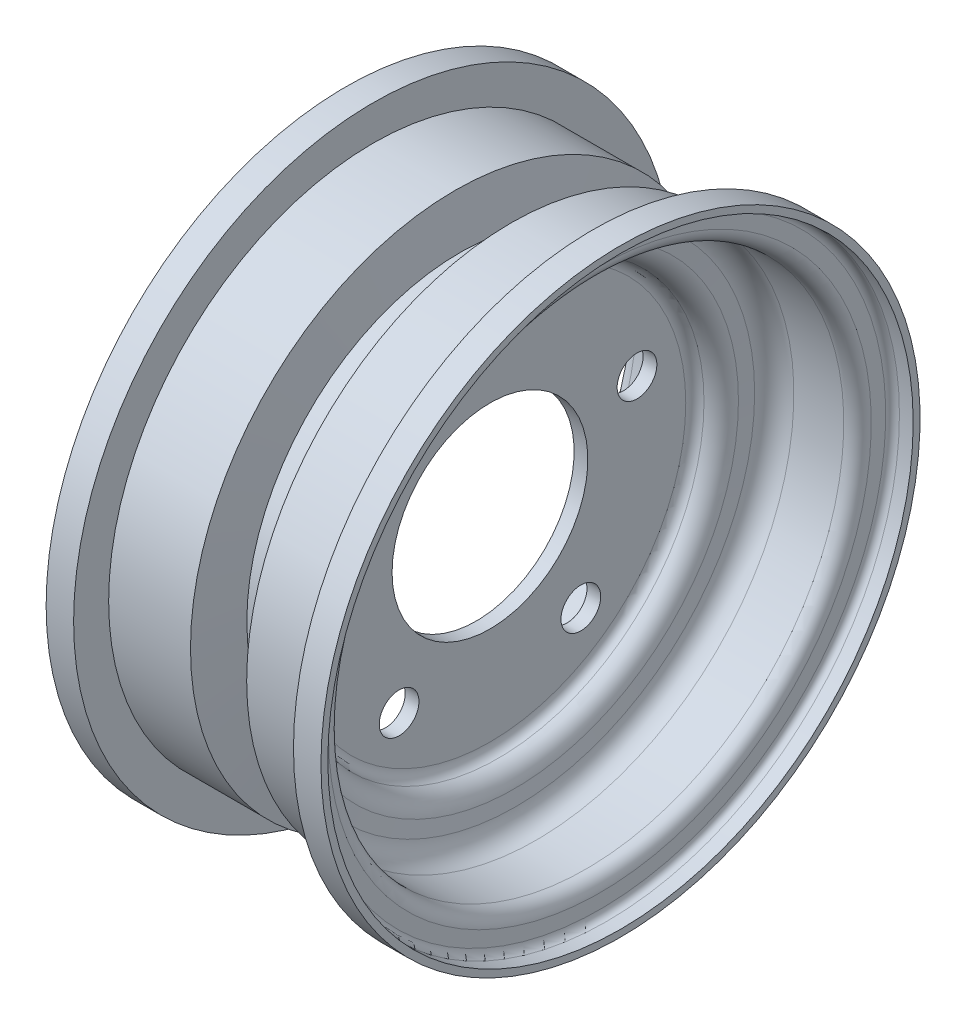
ISO-10303-21;
HEADER;
FILE_DESCRIPTION(('STEP AP214'),'2;1');
FILE_NAME('part.step','',(''),(''),'','','');
FILE_SCHEMA(('AUTOMOTIVE_DESIGN { 1 0 10303 214 1 1 1 1 }'));
ENDSEC;
DATA;
#1=APPLICATION_CONTEXT('core data for automotive mechanical design processes');
#2=APPLICATION_PROTOCOL_DEFINITION('international standard','automotive_design',2000,#1);
#3=PRODUCT_CONTEXT('',#1,'mechanical');
#4=PRODUCT('Part','Part','',(#3));
#5=PRODUCT_RELATED_PRODUCT_CATEGORY('part','',(#4));
#6=PRODUCT_DEFINITION_FORMATION('','',#4);
#7=PRODUCT_DEFINITION_CONTEXT('part definition',#1,'design');
#8=PRODUCT_DEFINITION('design','',#6,#7);
#9=PRODUCT_DEFINITION_SHAPE('','',#8);
#10=(LENGTH_UNIT() NAMED_UNIT(*) SI_UNIT(.MILLI.,.METRE.));
#11=(NAMED_UNIT(*) PLANE_ANGLE_UNIT() SI_UNIT($,.RADIAN.));
#12=(NAMED_UNIT(*) SI_UNIT($,.STERADIAN.) SOLID_ANGLE_UNIT());
#13=UNCERTAINTY_MEASURE_WITH_UNIT(LENGTH_MEASURE(1.E-05),#10,'distance_accuracy_value','');
#14=(GEOMETRIC_REPRESENTATION_CONTEXT(3) GLOBAL_UNCERTAINTY_ASSIGNED_CONTEXT((#13)) GLOBAL_UNIT_ASSIGNED_CONTEXT((#10,
#11,#12)) REPRESENTATION_CONTEXT('',''));
#15=CARTESIAN_POINT('',(0.,0.,0.));
#16=DIRECTION('',(0.,0.,1.));
#17=DIRECTION('',(1.,0.,0.));
#18=AXIS2_PLACEMENT_3D('',#15,#16,#17);
#19=CARTESIAN_POINT('',(0.,0.,0.));
#20=DIRECTION('',(-1.,0.,0.));
#21=DIRECTION('',(0.,0.,1.));
#22=AXIS2_PLACEMENT_3D('',#19,#20,#21);
#23=CYLINDRICAL_SURFACE('',#22,110.744);
#24=CARTESIAN_POINT('',(50.8,0.,0.));
#25=DIRECTION('',(-1.,0.,0.));
#26=DIRECTION('',(0.,0.,1.));
#27=AXIS2_PLACEMENT_3D('',#24,#25,#26);
#28=CIRCLE('',#27,110.744);
#29=CARTESIAN_POINT('',(50.8,0.,110.744));
#30=VERTEX_POINT('',#29);
#31=EDGE_CURVE('E130',#30,#30,#28,.T.);
#32=ORIENTED_EDGE('',*,*,#31,.T.);
#33=EDGE_LOOP('',(#32));
#34=FACE_BOUND('',#33,.T.);
#35=CARTESIAN_POINT('',(40.64,0.,0.));
#36=DIRECTION('',(-1.,0.,0.));
#37=DIRECTION('',(0.,0.,1.));
#38=AXIS2_PLACEMENT_3D('',#35,#36,#37);
#39=CIRCLE('',#38,110.744);
#40=CARTESIAN_POINT('',(40.64,0.,110.744));
#41=VERTEX_POINT('',#40);
#42=EDGE_CURVE('E99',#41,#41,#39,.T.);
#43=ORIENTED_EDGE('',*,*,#42,.F.);
#44=EDGE_LOOP('',(#43));
#45=FACE_BOUND('',#44,.T.);
#46=ADVANCED_FACE('F37',(#34,#45),#23,.T.);
#47=CARTESIAN_POINT('',(40.64,0.,0.));
#48=DIRECTION('',(-1.,0.,0.));
#49=DIRECTION('',(0.,0.,1.));
#50=AXIS2_PLACEMENT_3D('',#47,#48,#49);
#51=PLANE('',#50);
#52=ORIENTED_EDGE('',*,*,#42,.T.);
#53=EDGE_LOOP('',(#52));
#54=FACE_BOUND('',#53,.T.);
#55=CARTESIAN_POINT('',(40.64,0.,0.));
#56=DIRECTION('',(-1.,0.,0.));
#57=DIRECTION('',(0.,0.,1.));
#58=AXIS2_PLACEMENT_3D('',#55,#56,#57);
#59=CIRCLE('',#58,97.79);
#60=CARTESIAN_POINT('',(40.64,0.,97.79));
#61=VERTEX_POINT('',#60);
#62=EDGE_CURVE('E115',#61,#61,#59,.T.);
#63=ORIENTED_EDGE('',*,*,#62,.F.);
#64=EDGE_LOOP('',(#63));
#65=FACE_BOUND('',#64,.T.);
#66=ADVANCED_FACE('F216',(#54,#65),#51,.T.);
#67=CARTESIAN_POINT('',(0.,0.,0.));
#68=DIRECTION('',(-1.,0.,0.));
#69=DIRECTION('',(0.,0.,1.));
#70=AXIS2_PLACEMENT_3D('',#67,#68,#69);
#71=CYLINDRICAL_SURFACE('',#70,97.79);
#72=ORIENTED_EDGE('',*,*,#62,.T.);
#73=EDGE_LOOP('',(#72));
#74=FACE_BOUND('',#73,.T.);
#75=CARTESIAN_POINT('',(10.3860275441826,0.,0.));
#76=DIRECTION('',(-1.,0.,0.));
#77=DIRECTION('',(0.,0.,1.));
#78=AXIS2_PLACEMENT_3D('',#75,#76,#77);
#79=CIRCLE('',#78,97.79);
#80=CARTESIAN_POINT('',(10.3860275441826,0.,97.79));
#81=VERTEX_POINT('',#80);
#82=EDGE_CURVE('E118',#81,#81,#79,.T.);
#83=ORIENTED_EDGE('',*,*,#82,.F.);
#84=EDGE_LOOP('',(#83));
#85=FACE_BOUND('',#84,.T.);
#86=ADVANCED_FACE('F222',(#74,#85),#71,.T.);
#87=CARTESIAN_POINT('',(8.60802754418257,0.,0.));
#88=DIRECTION('',(1.,0.,0.));
#89=DIRECTION('',(0.,0.,-1.));
#90=AXIS2_PLACEMENT_3D('',#87,#88,#89);
#91=CONICAL_SURFACE('',#90,78.74,1.47773259807048);
#92=ORIENTED_EDGE('',*,*,#82,.T.);
#93=EDGE_LOOP('',(#92));
#94=FACE_BOUND('',#93,.T.);
#95=CARTESIAN_POINT('',(8.60802754418257,0.,0.));
#96=DIRECTION('',(-1.,0.,0.));
#97=DIRECTION('',(0.,0.,1.));
#98=AXIS2_PLACEMENT_3D('',#95,#96,#97);
#99=CIRCLE('',#98,78.74);
#100=CARTESIAN_POINT('',(8.60802754418257,0.,78.74));
#101=VERTEX_POINT('',#100);
#102=EDGE_CURVE('E121',#101,#101,#99,.T.);
#103=ORIENTED_EDGE('',*,*,#102,.F.);
#104=EDGE_LOOP('',(#103));
#105=FACE_BOUND('',#104,.T.);
#106=ADVANCED_FACE('F571',(#94,#105),#91,.T.);
#107=CARTESIAN_POINT('',(0.,0.,0.));
#108=DIRECTION('',(-1.,0.,0.));
#109=DIRECTION('',(0.,0.,1.));
#110=AXIS2_PLACEMENT_3D('',#107,#108,#109);
#111=CYLINDRICAL_SURFACE('',#110,78.74);
#112=ORIENTED_EDGE('',*,*,#102,.T.);
#113=EDGE_LOOP('',(#112));
#114=FACE_BOUND('',#113,.T.);
#115=CARTESIAN_POINT('',(-8.60802754418257,0.,0.));
#116=DIRECTION('',(-1.,0.,0.));
#117=DIRECTION('',(0.,0.,1.));
#118=AXIS2_PLACEMENT_3D('',#115,#116,#117);
#119=CIRCLE('',#118,78.74);
#120=CARTESIAN_POINT('',(-8.60802754418257,0.,78.74));
#121=VERTEX_POINT('',#120);
#122=EDGE_CURVE('E142',#121,#121,#119,.T.);
#123=ORIENTED_EDGE('',*,*,#122,.F.);
#124=EDGE_LOOP('',(#123));
#125=FACE_BOUND('',#124,.T.);
#126=ADVANCED_FACE('F194',(#114,#125),#111,.T.);
#127=CARTESIAN_POINT('',(0.,0.,0.));
#128=DIRECTION('',(-1.,0.,0.));
#129=DIRECTION('',(0.,0.,1.));
#130=AXIS2_PLACEMENT_3D('',#127,#128,#129);
#131=CYLINDRICAL_SURFACE('',#130,36.195);
#132=CARTESIAN_POINT('',(2.54,0.,0.));
#133=DIRECTION('',(-1.,0.,0.));
#134=DIRECTION('',(0.,0.,1.));
#135=AXIS2_PLACEMENT_3D('',#132,#133,#134);
#136=CIRCLE('',#135,36.195);
#137=CARTESIAN_POINT('',(2.54,0.,36.195));
#138=VERTEX_POINT('',#137);
#139=EDGE_CURVE('E124',#138,#138,#136,.T.);
#140=ORIENTED_EDGE('',*,*,#139,.F.);
#141=EDGE_LOOP('',(#140));
#142=FACE_BOUND('',#141,.T.);
#143=CARTESIAN_POINT('',(-2.54,0.,0.));
#144=DIRECTION('',(-1.,0.,0.));
#145=DIRECTION('',(0.,0.,1.));
#146=AXIS2_PLACEMENT_3D('',#143,#144,#145);
#147=CIRCLE('',#146,36.195);
#148=CARTESIAN_POINT('',(-2.54,0.,36.195));
#149=VERTEX_POINT('',#148);
#150=EDGE_CURVE('E145',#149,#149,#147,.T.);
#151=ORIENTED_EDGE('',*,*,#150,.T.);
#152=EDGE_LOOP('',(#151));
#153=FACE_BOUND('',#152,.T.);
#154=ADVANCED_FACE('F179',(#142,#153),#131,.F.);
#155=CARTESIAN_POINT('',(2.54,0.,0.));
#156=DIRECTION('',(-1.,0.,0.));
#157=DIRECTION('',(0.,0.,1.));
#158=AXIS2_PLACEMENT_3D('',#155,#156,#157);
#159=PLANE('',#158);
#160=CARTESIAN_POINT('',(2.54,0.,0.));
#161=DIRECTION('',(-1.,0.,0.));
#162=DIRECTION('',(0.,0.,1.));
#163=AXIS2_PLACEMENT_3D('',#160,#161,#162);
#164=CIRCLE('',#163,72.39);
#165=CARTESIAN_POINT('',(2.54,0.,72.39));
#166=VERTEX_POINT('',#165);
#167=EDGE_CURVE('E93',#166,#166,#164,.F.);
#168=ORIENTED_EDGE('',*,*,#167,.T.);
#169=EDGE_LOOP('',(#168));
#170=FACE_BOUND('',#169,.T.);
#171=CARTESIAN_POINT('',(2.54,57.15,0.));
#172=DIRECTION('',(1.,0.,0.));
#173=DIRECTION('',(0.,0.,-1.));
#174=AXIS2_PLACEMENT_3D('',#171,#172,#173);
#175=CIRCLE('',#174,7.342251);
#176=CARTESIAN_POINT('',(2.54,57.15,-7.34225099999993));
#177=VERTEX_POINT('',#176);
#178=EDGE_CURVE('E168',#177,#177,#175,.T.);
#179=ORIENTED_EDGE('',*,*,#178,.F.);
#180=EDGE_LOOP('',(#179));
#181=FACE_BOUND('',#180,.T.);
#182=CARTESIAN_POINT('',(2.54,17.6603212285283,-54.3528799062679));
#183=DIRECTION('',(1.,0.,0.));
#184=DIRECTION('',(0.,0.,-1.));
#185=AXIS2_PLACEMENT_3D('',#182,#183,#184);
#186=CIRCLE('',#185,7.34225099999999);
#187=CARTESIAN_POINT('',(2.54,17.6603212285283,-61.6951309062679));
#188=VERTEX_POINT('',#187);
#189=EDGE_CURVE('E104',#188,#188,#186,.T.);
#190=ORIENTED_EDGE('',*,*,#189,.F.);
#191=EDGE_LOOP('',(#190));
#192=FACE_BOUND('',#191,.T.);
#193=CARTESIAN_POINT('',(2.54,-46.2353212285282,-33.5919271685147));
#194=DIRECTION('',(1.,0.,0.));
#195=DIRECTION('',(0.,0.,-1.));
#196=AXIS2_PLACEMENT_3D('',#193,#194,#195);
#197=CIRCLE('',#196,7.34225099999999);
#198=CARTESIAN_POINT('',(2.54,-46.2353212285282,-40.9341781685147));
#199=VERTEX_POINT('',#198);
#200=EDGE_CURVE('E103',#199,#199,#197,.T.);
#201=ORIENTED_EDGE('',*,*,#200,.F.);
#202=EDGE_LOOP('',(#201));
#203=FACE_BOUND('',#202,.T.);
#204=CARTESIAN_POINT('',(2.54,-46.2353212285282,33.5919271685149));
#205=DIRECTION('',(1.,0.,0.));
#206=DIRECTION('',(0.,0.,-1.));
#207=AXIS2_PLACEMENT_3D('',#204,#205,#206);
#208=CIRCLE('',#207,7.34225099999999);
#209=CARTESIAN_POINT('',(2.54,-46.2353212285282,26.2496761685149));
#210=VERTEX_POINT('',#209);
#211=EDGE_CURVE('E108',#210,#210,#208,.T.);
#212=ORIENTED_EDGE('',*,*,#211,.F.);
#213=EDGE_LOOP('',(#212));
#214=FACE_BOUND('',#213,.T.);
#215=CARTESIAN_POINT('',(2.54,17.6603212285283,54.352879906268));
#216=DIRECTION('',(1.,0.,0.));
#217=DIRECTION('',(0.,0.,-1.));
#218=AXIS2_PLACEMENT_3D('',#215,#216,#217);
#219=CIRCLE('',#218,7.34225099999999);
#220=CARTESIAN_POINT('',(2.54,17.6603212285283,47.010628906268));
#221=VERTEX_POINT('',#220);
#222=EDGE_CURVE('E112',#221,#221,#219,.T.);
#223=ORIENTED_EDGE('',*,*,#222,.F.);
#224=EDGE_LOOP('',(#223));
#225=FACE_BOUND('',#224,.T.);
#226=ORIENTED_EDGE('',*,*,#139,.T.);
#227=EDGE_LOOP('',(#226));
#228=FACE_BOUND('',#227,.T.);
#229=ADVANCED_FACE('F175',(#170,#181,#192,#203,#214,#225,#228),#159,.F.);
#230=CARTESIAN_POINT('',(10.922,0.,0.));
#231=DIRECTION('',(1.,0.,0.));
#232=DIRECTION('',(0.,0.,-1.));
#233=AXIS2_PLACEMENT_3D('',#230,#231,#232);
#234=CONICAL_SURFACE('',#233,76.2,1.47773259807048);
#235=CARTESIAN_POINT('',(12.054891425979,0.,0.));
#236=DIRECTION('',(1.,0.,0.));
#237=DIRECTION('',(0.,0.,-1.));
#238=AXIS2_PLACEMENT_3D('',#235,#236,#237);
#239=CIRCLE('',#238,88.3381224212042);
#240=CARTESIAN_POINT('',(12.054891425979,0.,-88.3381224212042));
#241=VERTEX_POINT('',#240);
#242=EDGE_CURVE('E72',#241,#241,#239,.T.);
#243=ORIENTED_EDGE('',*,*,#242,.T.);
#244=EDGE_LOOP('',(#243));
#245=FACE_BOUND('',#244,.T.);
#246=CARTESIAN_POINT('',(11.5434551145851,0.,0.));
#247=DIRECTION('',(-1.,0.,0.));
#248=DIRECTION('',(0.,0.,1.));
#249=AXIS2_PLACEMENT_3D('',#246,#247,#248);
#250=CIRCLE('',#249,82.8584476562691);
#251=CARTESIAN_POINT('',(11.5434551145851,0.,82.8584476562691));
#252=VERTEX_POINT('',#251);
#253=EDGE_CURVE('E75',#252,#252,#250,.T.);
#254=ORIENTED_EDGE('',*,*,#253,.T.);
#255=EDGE_LOOP('',(#254));
#256=FACE_BOUND('',#255,.T.);
#257=ADVANCED_FACE('F178',(#245,#256),#234,.F.);
#258=CARTESIAN_POINT('',(0.,0.,0.));
#259=DIRECTION('',(-1.,0.,0.));
#260=DIRECTION('',(0.,0.,1.));
#261=AXIS2_PLACEMENT_3D('',#258,#259,#260);
#262=CYLINDRICAL_SURFACE('',#261,95.25);
#263=CARTESIAN_POINT('',(38.1,0.,0.));
#264=DIRECTION('',(-1.,0.,0.));
#265=DIRECTION('',(0.,0.,1.));
#266=AXIS2_PLACEMENT_3D('',#263,#264,#265);
#267=CIRCLE('',#266,95.25);
#268=CARTESIAN_POINT('',(38.1,0.,95.25));
#269=VERTEX_POINT('',#268);
#270=EDGE_CURVE('E57',#269,#269,#267,.F.);
#271=ORIENTED_EDGE('',*,*,#270,.T.);
#272=EDGE_LOOP('',(#271));
#273=FACE_BOUND('',#272,.T.);
#274=CARTESIAN_POINT('',(19.6419173674523,0.,0.));
#275=DIRECTION('',(-1.,0.,0.));
#276=DIRECTION('',(0.,0.,1.));
#277=AXIS2_PLACEMENT_3D('',#274,#275,#276);
#278=CIRCLE('',#277,95.25);
#279=CARTESIAN_POINT('',(19.6419173674523,0.,95.25));
#280=VERTEX_POINT('',#279);
#281=EDGE_CURVE('E78',#280,#280,#278,.T.);
#282=ORIENTED_EDGE('',*,*,#281,.T.);
#283=EDGE_LOOP('',(#282));
#284=FACE_BOUND('',#283,.T.);
#285=ADVANCED_FACE('F370',(#273,#284),#262,.F.);
#286=CARTESIAN_POINT('',(43.18,0.,0.));
#287=DIRECTION('',(-1.,0.,0.));
#288=DIRECTION('',(0.,0.,1.));
#289=AXIS2_PLACEMENT_3D('',#286,#287,#288);
#290=PLANE('',#289);
#291=CARTESIAN_POINT('',(43.18,0.,0.));
#292=DIRECTION('',(-1.,0.,0.));
#293=DIRECTION('',(0.,0.,1.));
#294=AXIS2_PLACEMENT_3D('',#291,#292,#293);
#295=CIRCLE('',#294,105.664);
#296=CARTESIAN_POINT('',(43.18,0.,105.664));
#297=VERTEX_POINT('',#296);
#298=EDGE_CURVE('E10',#297,#297,#295,.F.);
#299=ORIENTED_EDGE('',*,*,#298,.T.);
#300=EDGE_LOOP('',(#299));
#301=FACE_BOUND('',#300,.T.);
#302=CARTESIAN_POINT('',(43.18,0.,0.));
#303=DIRECTION('',(-1.,0.,0.));
#304=DIRECTION('',(0.,0.,1.));
#305=AXIS2_PLACEMENT_3D('',#302,#303,#304);
#306=CIRCLE('',#305,100.33);
#307=CARTESIAN_POINT('',(43.18,0.,100.33));
#308=VERTEX_POINT('',#307);
#309=EDGE_CURVE('E60',#308,#308,#306,.T.);
#310=ORIENTED_EDGE('',*,*,#309,.T.);
#311=EDGE_LOOP('',(#310));
#312=FACE_BOUND('',#311,.T.);
#313=ADVANCED_FACE('F364',(#301,#312),#290,.F.);
#314=CARTESIAN_POINT('',(0.,0.,0.));
#315=DIRECTION('',(-1.,0.,0.));
#316=DIRECTION('',(0.,0.,1.));
#317=AXIS2_PLACEMENT_3D('',#314,#315,#316);
#318=CYLINDRICAL_SURFACE('',#317,108.204);
#319=CARTESIAN_POINT('',(45.72,0.,0.));
#320=DIRECTION('',(-1.,0.,0.));
#321=DIRECTION('',(0.,0.,1.));
#322=AXIS2_PLACEMENT_3D('',#319,#320,#321);
#323=CIRCLE('',#322,108.204);
#324=CARTESIAN_POINT('',(45.72,0.,108.204));
#325=VERTEX_POINT('',#324);
#326=EDGE_CURVE('E44',#325,#325,#323,.T.);
#327=ORIENTED_EDGE('',*,*,#326,.T.);
#328=EDGE_LOOP('',(#327));
#329=FACE_BOUND('',#328,.T.);
#330=CARTESIAN_POINT('',(50.8,0.,0.));
#331=DIRECTION('',(-1.,0.,0.));
#332=DIRECTION('',(0.,0.,1.));
#333=AXIS2_PLACEMENT_3D('',#330,#331,#332);
#334=CIRCLE('',#333,108.204);
#335=CARTESIAN_POINT('',(50.8,0.,108.204));
#336=VERTEX_POINT('',#335);
#337=EDGE_CURVE('E127',#336,#336,#334,.T.);
#338=ORIENTED_EDGE('',*,*,#337,.F.);
#339=EDGE_LOOP('',(#338));
#340=FACE_BOUND('',#339,.T.);
#341=ADVANCED_FACE('F369',(#329,#340),#318,.F.);
#342=CARTESIAN_POINT('',(50.8,1.38777878078145E-13,0.));
#343=DIRECTION('',(1.,0.,0.));
#344=DIRECTION('',(0.,0.,-1.));
#345=AXIS2_PLACEMENT_3D('',#342,#343,#344);
#346=PLANE('',#345);
#347=ORIENTED_EDGE('',*,*,#337,.T.);
#348=EDGE_LOOP('',(#347));
#349=FACE_BOUND('',#348,.T.);
#350=ORIENTED_EDGE('',*,*,#31,.F.);
#351=EDGE_LOOP('',(#350));
#352=FACE_BOUND('',#351,.T.);
#353=ADVANCED_FACE('F382',(#349,#352),#346,.T.);
#354=CARTESIAN_POINT('',(0.,0.,0.));
#355=DIRECTION('',(1.,0.,0.));
#356=DIRECTION('',(0.,0.,1.));
#357=AXIS2_PLACEMENT_3D('',#354,#355,#356);
#358=CYLINDRICAL_SURFACE('',#357,110.744);
#359=CARTESIAN_POINT('',(-50.8,0.,0.));
#360=DIRECTION('',(-1.,0.,0.));
#361=DIRECTION('',(0.,0.,1.));
#362=AXIS2_PLACEMENT_3D('',#359,#360,#361);
#363=CIRCLE('',#362,110.744);
#364=CARTESIAN_POINT('',(-50.8,0.,110.744));
#365=VERTEX_POINT('',#364);
#366=EDGE_CURVE('E151',#365,#365,#363,.T.);
#367=ORIENTED_EDGE('',*,*,#366,.F.);
#368=EDGE_LOOP('',(#367));
#369=FACE_BOUND('',#368,.T.);
#370=CARTESIAN_POINT('',(-40.64,0.,0.));
#371=DIRECTION('',(-1.,0.,0.));
#372=DIRECTION('',(0.,0.,1.));
#373=AXIS2_PLACEMENT_3D('',#370,#371,#372);
#374=CIRCLE('',#373,110.744);
#375=CARTESIAN_POINT('',(-40.64,0.,110.744));
#376=VERTEX_POINT('',#375);
#377=EDGE_CURVE('E133',#376,#376,#374,.T.);
#378=ORIENTED_EDGE('',*,*,#377,.T.);
#379=EDGE_LOOP('',(#378));
#380=FACE_BOUND('',#379,.T.);
#381=ADVANCED_FACE('F516',(#369,#380),#358,.T.);
#382=CARTESIAN_POINT('',(-40.64,0.,0.));
#383=DIRECTION('',(1.,0.,0.));
#384=DIRECTION('',(0.,0.,1.));
#385=AXIS2_PLACEMENT_3D('',#382,#383,#384);
#386=PLANE('',#385);
#387=ORIENTED_EDGE('',*,*,#377,.F.);
#388=EDGE_LOOP('',(#387));
#389=FACE_BOUND('',#388,.T.);
#390=CARTESIAN_POINT('',(-40.64,0.,0.));
#391=DIRECTION('',(-1.,0.,0.));
#392=DIRECTION('',(0.,0.,1.));
#393=AXIS2_PLACEMENT_3D('',#390,#391,#392);
#394=CIRCLE('',#393,97.79);
#395=CARTESIAN_POINT('',(-40.64,0.,97.79));
#396=VERTEX_POINT('',#395);
#397=EDGE_CURVE('E136',#396,#396,#394,.T.);
#398=ORIENTED_EDGE('',*,*,#397,.T.);
#399=EDGE_LOOP('',(#398));
#400=FACE_BOUND('',#399,.T.);
#401=ADVANCED_FACE('F506',(#389,#400),#386,.T.);
#402=CARTESIAN_POINT('',(0.,0.,0.));
#403=DIRECTION('',(1.,0.,0.));
#404=DIRECTION('',(0.,0.,1.));
#405=AXIS2_PLACEMENT_3D('',#402,#403,#404);
#406=CYLINDRICAL_SURFACE('',#405,97.79);
#407=ORIENTED_EDGE('',*,*,#397,.F.);
#408=EDGE_LOOP('',(#407));
#409=FACE_BOUND('',#408,.T.);
#410=CARTESIAN_POINT('',(-10.3860275441826,0.,0.));
#411=DIRECTION('',(-1.,0.,0.));
#412=DIRECTION('',(0.,0.,1.));
#413=AXIS2_PLACEMENT_3D('',#410,#411,#412);
#414=CIRCLE('',#413,97.79);
#415=CARTESIAN_POINT('',(-10.3860275441826,0.,97.79));
#416=VERTEX_POINT('',#415);
#417=EDGE_CURVE('E139',#416,#416,#414,.T.);
#418=ORIENTED_EDGE('',*,*,#417,.T.);
#419=EDGE_LOOP('',(#418));
#420=FACE_BOUND('',#419,.T.);
#421=ADVANCED_FACE('F211',(#409,#420),#406,.T.);
#422=CARTESIAN_POINT('',(-8.60802754418257,0.,0.));
#423=DIRECTION('',(-1.,0.,0.));
#424=DIRECTION('',(0.,0.,-1.));
#425=AXIS2_PLACEMENT_3D('',#422,#423,#424);
#426=CONICAL_SURFACE('',#425,78.74,1.47773259807048);
#427=ORIENTED_EDGE('',*,*,#417,.F.);
#428=EDGE_LOOP('',(#427));
#429=FACE_BOUND('',#428,.T.);
#430=ORIENTED_EDGE('',*,*,#122,.T.);
#431=EDGE_LOOP('',(#430));
#432=FACE_BOUND('',#431,.T.);
#433=ADVANCED_FACE('F201',(#429,#432),#426,.T.);
#434=CARTESIAN_POINT('',(-2.54,0.,0.));
#435=DIRECTION('',(1.,0.,0.));
#436=DIRECTION('',(0.,0.,1.));
#437=AXIS2_PLACEMENT_3D('',#434,#435,#436);
#438=PLANE('',#437);
#439=CARTESIAN_POINT('',(-2.54,0.,0.));
#440=DIRECTION('',(1.,0.,0.));
#441=DIRECTION('',(0.,0.,-1.));
#442=AXIS2_PLACEMENT_3D('',#439,#440,#441);
#443=CIRCLE('',#442,72.39);
#444=CARTESIAN_POINT('',(-2.54,0.,-72.39));
#445=VERTEX_POINT('',#444);
#446=EDGE_CURVE('E96',#445,#445,#443,.F.);
#447=ORIENTED_EDGE('',*,*,#446,.T.);
#448=EDGE_LOOP('',(#447));
#449=FACE_BOUND('',#448,.T.);
#450=CARTESIAN_POINT('',(-2.54,57.15,0.));
#451=DIRECTION('',(1.,0.,0.));
#452=DIRECTION('',(0.,0.,-1.));
#453=AXIS2_PLACEMENT_3D('',#450,#451,#452);
#454=CIRCLE('',#453,7.34225099999999);
#455=CARTESIAN_POINT('',(-2.54,57.15,-7.34225099999992));
#456=VERTEX_POINT('',#455);
#457=EDGE_CURVE('E165',#456,#456,#454,.T.);
#458=ORIENTED_EDGE('',*,*,#457,.T.);
#459=EDGE_LOOP('',(#458));
#460=FACE_BOUND('',#459,.T.);
#461=CARTESIAN_POINT('',(-2.54,17.6603212285283,-54.3528799062679));
#462=DIRECTION('',(1.,0.,0.));
#463=DIRECTION('',(0.,0.,-1.));
#464=AXIS2_PLACEMENT_3D('',#461,#462,#463);
#465=CIRCLE('',#464,7.34225099999999);
#466=CARTESIAN_POINT('',(-2.54,17.6603212285283,-61.6951309062679));
#467=VERTEX_POINT('',#466);
#468=EDGE_CURVE('E100',#467,#467,#465,.T.);
#469=ORIENTED_EDGE('',*,*,#468,.T.);
#470=EDGE_LOOP('',(#469));
#471=FACE_BOUND('',#470,.T.);
#472=CARTESIAN_POINT('',(-2.54,-46.2353212285282,-33.5919271685147));
#473=DIRECTION('',(1.,0.,0.));
#474=DIRECTION('',(0.,0.,-1.));
#475=AXIS2_PLACEMENT_3D('',#472,#473,#474);
#476=CIRCLE('',#475,7.34225099999999);
#477=CARTESIAN_POINT('',(-2.54,-46.2353212285282,-40.9341781685147));
#478=VERTEX_POINT('',#477);
#479=EDGE_CURVE('E105',#478,#478,#476,.T.);
#480=ORIENTED_EDGE('',*,*,#479,.T.);
#481=EDGE_LOOP('',(#480));
#482=FACE_BOUND('',#481,.T.);
#483=CARTESIAN_POINT('',(-2.54,-46.2353212285282,33.5919271685149));
#484=DIRECTION('',(1.,0.,0.));
#485=DIRECTION('',(0.,0.,-1.));
#486=AXIS2_PLACEMENT_3D('',#483,#484,#485);
#487=CIRCLE('',#486,7.34225099999999);
#488=CARTESIAN_POINT('',(-2.54,-46.2353212285282,26.2496761685149));
#489=VERTEX_POINT('',#488);
#490=EDGE_CURVE('E109',#489,#489,#487,.T.);
#491=ORIENTED_EDGE('',*,*,#490,.T.);
#492=EDGE_LOOP('',(#491));
#493=FACE_BOUND('',#492,.T.);
#494=CARTESIAN_POINT('',(-2.54,17.6603212285283,54.352879906268));
#495=DIRECTION('',(1.,0.,0.));
#496=DIRECTION('',(0.,0.,-1.));
#497=AXIS2_PLACEMENT_3D('',#494,#495,#496);
#498=CIRCLE('',#497,7.34225099999999);
#499=CARTESIAN_POINT('',(-2.54,17.6603212285283,47.010628906268));
#500=VERTEX_POINT('',#499);
#501=EDGE_CURVE('E154',#500,#500,#498,.T.);
#502=ORIENTED_EDGE('',*,*,#501,.T.);
#503=EDGE_LOOP('',(#502));
#504=FACE_BOUND('',#503,.T.);
#505=ORIENTED_EDGE('',*,*,#150,.F.);
#506=EDGE_LOOP('',(#505));
#507=FACE_BOUND('',#506,.T.);
#508=ADVANCED_FACE('F198',(#449,#460,#471,#482,#493,#504,#507),#438,.F.);
#509=CARTESIAN_POINT('',(-10.922,0.,0.));
#510=DIRECTION('',(-1.,0.,0.));
#511=DIRECTION('',(0.,0.,-1.));
#512=AXIS2_PLACEMENT_3D('',#509,#510,#511);
#513=CONICAL_SURFACE('',#512,76.2,1.47773259807048);
#514=CARTESIAN_POINT('',(-12.054891425979,0.,0.));
#515=DIRECTION('',(-1.,0.,0.));
#516=DIRECTION('',(0.,0.,1.));
#517=AXIS2_PLACEMENT_3D('',#514,#515,#516);
#518=CIRCLE('',#517,88.3381224212042);
#519=CARTESIAN_POINT('',(-12.054891425979,0.,88.3381224212042));
#520=VERTEX_POINT('',#519);
#521=EDGE_CURVE('E87',#520,#520,#518,.T.);
#522=ORIENTED_EDGE('',*,*,#521,.T.);
#523=EDGE_LOOP('',(#522));
#524=FACE_BOUND('',#523,.T.);
#525=CARTESIAN_POINT('',(-11.5434551145851,0.,0.));
#526=DIRECTION('',(1.,0.,0.));
#527=DIRECTION('',(0.,0.,-1.));
#528=AXIS2_PLACEMENT_3D('',#525,#526,#527);
#529=CIRCLE('',#528,82.8584476562691);
#530=CARTESIAN_POINT('',(-11.5434551145851,0.,-82.8584476562691));
#531=VERTEX_POINT('',#530);
#532=EDGE_CURVE('E90',#531,#531,#529,.T.);
#533=ORIENTED_EDGE('',*,*,#532,.T.);
#534=EDGE_LOOP('',(#533));
#535=FACE_BOUND('',#534,.T.);
#536=ADVANCED_FACE('F200',(#524,#535),#513,.F.);
#537=CARTESIAN_POINT('',(0.,0.,0.));
#538=DIRECTION('',(1.,0.,0.));
#539=DIRECTION('',(0.,0.,1.));
#540=AXIS2_PLACEMENT_3D('',#537,#538,#539);
#541=CYLINDRICAL_SURFACE('',#540,95.25);
#542=CARTESIAN_POINT('',(-38.1,0.,0.));
#543=DIRECTION('',(1.,0.,0.));
#544=DIRECTION('',(0.,0.,-1.));
#545=AXIS2_PLACEMENT_3D('',#542,#543,#544);
#546=CIRCLE('',#545,95.25);
#547=CARTESIAN_POINT('',(-38.1,0.,-95.25));
#548=VERTEX_POINT('',#547);
#549=EDGE_CURVE('E66',#548,#548,#546,.F.);
#550=ORIENTED_EDGE('',*,*,#549,.T.);
#551=EDGE_LOOP('',(#550));
#552=FACE_BOUND('',#551,.T.);
#553=CARTESIAN_POINT('',(-19.6419173674523,0.,0.));
#554=DIRECTION('',(-1.,0.,0.));
#555=DIRECTION('',(0.,0.,1.));
#556=AXIS2_PLACEMENT_3D('',#553,#554,#555);
#557=CIRCLE('',#556,95.25);
#558=CARTESIAN_POINT('',(-19.6419173674523,0.,95.25));
#559=VERTEX_POINT('',#558);
#560=EDGE_CURVE('E84',#559,#559,#557,.F.);
#561=ORIENTED_EDGE('',*,*,#560,.T.);
#562=EDGE_LOOP('',(#561));
#563=FACE_BOUND('',#562,.T.);
#564=ADVANCED_FACE('F208',(#552,#563),#541,.F.);
#565=CARTESIAN_POINT('',(-43.18,0.,0.));
#566=DIRECTION('',(1.,0.,0.));
#567=DIRECTION('',(0.,0.,1.));
#568=AXIS2_PLACEMENT_3D('',#565,#566,#567);
#569=PLANE('',#568);
#570=CARTESIAN_POINT('',(-43.18,0.,0.));
#571=DIRECTION('',(1.,0.,0.));
#572=DIRECTION('',(0.,0.,-1.));
#573=AXIS2_PLACEMENT_3D('',#570,#571,#572);
#574=CIRCLE('',#573,105.664);
#575=CARTESIAN_POINT('',(-43.18,0.,-105.664));
#576=VERTEX_POINT('',#575);
#577=EDGE_CURVE('E52',#576,#576,#574,.F.);
#578=ORIENTED_EDGE('',*,*,#577,.T.);
#579=EDGE_LOOP('',(#578));
#580=FACE_BOUND('',#579,.T.);
#581=CARTESIAN_POINT('',(-43.18,0.,0.));
#582=DIRECTION('',(1.,0.,0.));
#583=DIRECTION('',(0.,0.,-1.));
#584=AXIS2_PLACEMENT_3D('',#581,#582,#583);
#585=CIRCLE('',#584,100.33);
#586=CARTESIAN_POINT('',(-43.18,0.,-100.33));
#587=VERTEX_POINT('',#586);
#588=EDGE_CURVE('E63',#587,#587,#585,.T.);
#589=ORIENTED_EDGE('',*,*,#588,.T.);
#590=EDGE_LOOP('',(#589));
#591=FACE_BOUND('',#590,.T.);
#592=ADVANCED_FACE('F270',(#580,#591),#569,.F.);
#593=CARTESIAN_POINT('',(0.,0.,0.));
#594=DIRECTION('',(1.,0.,0.));
#595=DIRECTION('',(0.,0.,1.));
#596=AXIS2_PLACEMENT_3D('',#593,#594,#595);
#597=CYLINDRICAL_SURFACE('',#596,108.204);
#598=CARTESIAN_POINT('',(-45.72,0.,0.));
#599=DIRECTION('',(1.,0.,0.));
#600=DIRECTION('',(0.,0.,-1.));
#601=AXIS2_PLACEMENT_3D('',#598,#599,#600);
#602=CIRCLE('',#601,108.204);
#603=CARTESIAN_POINT('',(-45.72,0.,-108.204));
#604=VERTEX_POINT('',#603);
#605=EDGE_CURVE('E48',#604,#604,#602,.T.);
#606=ORIENTED_EDGE('',*,*,#605,.T.);
#607=EDGE_LOOP('',(#606));
#608=FACE_BOUND('',#607,.T.);
#609=CARTESIAN_POINT('',(-50.8,0.,0.));
#610=DIRECTION('',(-1.,0.,0.));
#611=DIRECTION('',(0.,0.,1.));
#612=AXIS2_PLACEMENT_3D('',#609,#610,#611);
#613=CIRCLE('',#612,108.204);
#614=CARTESIAN_POINT('',(-50.8,0.,108.204));
#615=VERTEX_POINT('',#614);
#616=EDGE_CURVE('E148',#615,#615,#613,.T.);
#617=ORIENTED_EDGE('',*,*,#616,.T.);
#618=EDGE_LOOP('',(#617));
#619=FACE_BOUND('',#618,.T.);
#620=ADVANCED_FACE('F273',(#608,#619),#597,.F.);
#621=CARTESIAN_POINT('',(-50.8,1.38777878078145E-13,0.));
#622=DIRECTION('',(-1.,0.,0.));
#623=DIRECTION('',(0.,0.,-1.));
#624=AXIS2_PLACEMENT_3D('',#621,#622,#623);
#625=PLANE('',#624);
#626=ORIENTED_EDGE('',*,*,#616,.F.);
#627=EDGE_LOOP('',(#626));
#628=FACE_BOUND('',#627,.T.);
#629=ORIENTED_EDGE('',*,*,#366,.T.);
#630=EDGE_LOOP('',(#629));
#631=FACE_BOUND('',#630,.T.);
#632=ADVANCED_FACE('F296',(#628,#631),#625,.T.);
#633=CARTESIAN_POINT('',(2.54,17.6603212285283,54.352879906268));
#634=DIRECTION('',(1.,0.,0.));
#635=DIRECTION('',(0.,0.,-1.));
#636=AXIS2_PLACEMENT_3D('',#633,#634,#635);
#637=CYLINDRICAL_SURFACE('',#636,7.34225099999999);
#638=ORIENTED_EDGE('',*,*,#222,.T.);
#639=EDGE_LOOP('',(#638));
#640=FACE_BOUND('',#639,.T.);
#641=ORIENTED_EDGE('',*,*,#501,.F.);
#642=EDGE_LOOP('',(#641));
#643=FACE_BOUND('',#642,.T.);
#644=ADVANCED_FACE('F300',(#640,#643),#637,.F.);
#645=CARTESIAN_POINT('',(2.54,-46.2353212285282,33.5919271685149));
#646=DIRECTION('',(1.,0.,0.));
#647=DIRECTION('',(0.,0.,-1.));
#648=AXIS2_PLACEMENT_3D('',#645,#646,#647);
#649=CYLINDRICAL_SURFACE('',#648,7.34225099999999);
#650=ORIENTED_EDGE('',*,*,#211,.T.);
#651=EDGE_LOOP('',(#650));
#652=FACE_BOUND('',#651,.T.);
#653=ORIENTED_EDGE('',*,*,#490,.F.);
#654=EDGE_LOOP('',(#653));
#655=FACE_BOUND('',#654,.T.);
#656=ADVANCED_FACE('F304',(#652,#655),#649,.F.);
#657=CARTESIAN_POINT('',(2.54,-46.2353212285282,-33.5919271685147));
#658=DIRECTION('',(1.,0.,0.));
#659=DIRECTION('',(0.,0.,-1.));
#660=AXIS2_PLACEMENT_3D('',#657,#658,#659);
#661=CYLINDRICAL_SURFACE('',#660,7.34225099999999);
#662=ORIENTED_EDGE('',*,*,#200,.T.);
#663=EDGE_LOOP('',(#662));
#664=FACE_BOUND('',#663,.T.);
#665=ORIENTED_EDGE('',*,*,#479,.F.);
#666=EDGE_LOOP('',(#665));
#667=FACE_BOUND('',#666,.T.);
#668=ADVANCED_FACE('F308',(#664,#667),#661,.F.);
#669=CARTESIAN_POINT('',(2.54,17.6603212285283,-54.3528799062679));
#670=DIRECTION('',(1.,0.,0.));
#671=DIRECTION('',(0.,0.,-1.));
#672=AXIS2_PLACEMENT_3D('',#669,#670,#671);
#673=CYLINDRICAL_SURFACE('',#672,7.34225099999999);
#674=ORIENTED_EDGE('',*,*,#189,.T.);
#675=EDGE_LOOP('',(#674));
#676=FACE_BOUND('',#675,.T.);
#677=ORIENTED_EDGE('',*,*,#468,.F.);
#678=EDGE_LOOP('',(#677));
#679=FACE_BOUND('',#678,.T.);
#680=ADVANCED_FACE('F312',(#676,#679),#673,.F.);
#681=CARTESIAN_POINT('',(2.54,57.15,0.));
#682=DIRECTION('',(1.,0.,0.));
#683=DIRECTION('',(0.,0.,-1.));
#684=AXIS2_PLACEMENT_3D('',#681,#682,#683);
#685=CYLINDRICAL_SURFACE('',#684,7.34225099999999);
#686=ORIENTED_EDGE('',*,*,#178,.T.);
#687=EDGE_LOOP('',(#686));
#688=FACE_BOUND('',#687,.T.);
#689=ORIENTED_EDGE('',*,*,#457,.F.);
#690=EDGE_LOOP('',(#689));
#691=FACE_BOUND('',#690,.T.);
#692=ADVANCED_FACE('F172',(#688,#691),#685,.F.);
#693=CARTESIAN_POINT('',(-6.35,0.,0.));
#694=DIRECTION('',(1.,0.,0.));
#695=DIRECTION('',(0.,0.,-1.));
#696=AXIS2_PLACEMENT_3D('',#693,#694,#695);
#697=TOROIDAL_SURFACE('',#696,72.39,3.81);
#698=CARTESIAN_POINT('',(-5.55214305770395,0.,0.));
#699=DIRECTION('',(-1.,0.,0.));
#700=DIRECTION('',(0.,0.,1.));
#701=AXIS2_PLACEMENT_3D('',#698,#699,#700);
#702=CIRCLE('',#701,76.1155233591578);
#703=CARTESIAN_POINT('',(-5.55214305770395,0.,76.1155233591578));
#704=VERTEX_POINT('',#703);
#705=EDGE_CURVE('E81',#704,#704,#702,.T.);
#706=ORIENTED_EDGE('',*,*,#705,.T.);
#707=EDGE_LOOP('',(#706));
#708=FACE_BOUND('',#707,.T.);
#709=ORIENTED_EDGE('',*,*,#446,.F.);
#710=EDGE_LOOP('',(#709));
#711=FACE_BOUND('',#710,.T.);
#712=ADVANCED_FACE('F228',(#708,#711),#697,.F.);
#713=CARTESIAN_POINT('',(6.35,0.,0.));
#714=DIRECTION('',(-1.,0.,0.));
#715=DIRECTION('',(0.,0.,1.));
#716=AXIS2_PLACEMENT_3D('',#713,#714,#715);
#717=TOROIDAL_SURFACE('',#716,72.39,3.81);
#718=CARTESIAN_POINT('',(5.55214305770398,0.,0.));
#719=DIRECTION('',(1.,0.,0.));
#720=DIRECTION('',(0.,0.,-1.));
#721=AXIS2_PLACEMENT_3D('',#718,#719,#720);
#722=CIRCLE('',#721,76.1155233591577);
#723=CARTESIAN_POINT('',(5.55214305770398,0.,-76.1155233591577));
#724=VERTEX_POINT('',#723);
#725=EDGE_CURVE('E69',#724,#724,#722,.T.);
#726=ORIENTED_EDGE('',*,*,#725,.T.);
#727=EDGE_LOOP('',(#726));
#728=FACE_BOUND('',#727,.T.);
#729=ORIENTED_EDGE('',*,*,#167,.F.);
#730=EDGE_LOOP('',(#729));
#731=FACE_BOUND('',#730,.T.);
#732=ADVANCED_FACE('F231',(#728,#731),#717,.F.);
#733=CARTESIAN_POINT('',(-19.6419173674523,0.,0.));
#734=DIRECTION('',(-1.,0.,0.));
#735=DIRECTION('',(0.,0.,1.));
#736=AXIS2_PLACEMENT_3D('',#733,#734,#735);
#737=TOROIDAL_SURFACE('',#736,87.63,7.62);
#738=ORIENTED_EDGE('',*,*,#560,.F.);
#739=EDGE_LOOP('',(#738));
#740=FACE_BOUND('',#739,.T.);
#741=ORIENTED_EDGE('',*,*,#521,.F.);
#742=EDGE_LOOP('',(#741));
#743=FACE_BOUND('',#742,.T.);
#744=ADVANCED_FACE('F235',(#740,#743),#737,.F.);
#745=CARTESIAN_POINT('',(-3.95642917311188,0.,0.));
#746=DIRECTION('',(1.,0.,0.));
#747=DIRECTION('',(0.,0.,-1.));
#748=AXIS2_PLACEMENT_3D('',#745,#746,#747);
#749=TOROIDAL_SURFACE('',#748,83.5665700774733,7.62);
#750=ORIENTED_EDGE('',*,*,#532,.F.);
#751=EDGE_LOOP('',(#750));
#752=FACE_BOUND('',#751,.T.);
#753=ORIENTED_EDGE('',*,*,#705,.F.);
#754=EDGE_LOOP('',(#753));
#755=FACE_BOUND('',#754,.T.);
#756=ADVANCED_FACE('F239',(#752,#755),#749,.T.);
#757=CARTESIAN_POINT('',(19.6419173674523,0.,0.));
#758=DIRECTION('',(-1.,0.,0.));
#759=DIRECTION('',(0.,0.,1.));
#760=AXIS2_PLACEMENT_3D('',#757,#758,#759);
#761=TOROIDAL_SURFACE('',#760,87.63,7.62);
#762=ORIENTED_EDGE('',*,*,#242,.F.);
#763=EDGE_LOOP('',(#762));
#764=FACE_BOUND('',#763,.T.);
#765=ORIENTED_EDGE('',*,*,#281,.F.);
#766=EDGE_LOOP('',(#765));
#767=FACE_BOUND('',#766,.T.);
#768=ADVANCED_FACE('F243',(#764,#767),#761,.F.);
#769=CARTESIAN_POINT('',(3.95642917311188,0.,0.));
#770=DIRECTION('',(1.,0.,0.));
#771=DIRECTION('',(0.,0.,-1.));
#772=AXIS2_PLACEMENT_3D('',#769,#770,#771);
#773=TOROIDAL_SURFACE('',#772,83.5665700774732,7.62);
#774=ORIENTED_EDGE('',*,*,#725,.F.);
#775=EDGE_LOOP('',(#774));
#776=FACE_BOUND('',#775,.T.);
#777=ORIENTED_EDGE('',*,*,#253,.F.);
#778=EDGE_LOOP('',(#777));
#779=FACE_BOUND('',#778,.T.);
#780=ADVANCED_FACE('F247',(#776,#779),#773,.T.);
#781=CARTESIAN_POINT('',(-38.1,0.,0.));
#782=DIRECTION('',(1.,0.,0.));
#783=DIRECTION('',(0.,0.,-1.));
#784=AXIS2_PLACEMENT_3D('',#781,#782,#783);
#785=TOROIDAL_SURFACE('',#784,100.33,5.08);
#786=ORIENTED_EDGE('',*,*,#588,.F.);
#787=EDGE_LOOP('',(#786));
#788=FACE_BOUND('',#787,.T.);
#789=ORIENTED_EDGE('',*,*,#549,.F.);
#790=EDGE_LOOP('',(#789));
#791=FACE_BOUND('',#790,.T.);
#792=ADVANCED_FACE('F251',(#788,#791),#785,.T.);
#793=CARTESIAN_POINT('',(38.1,0.,0.));
#794=DIRECTION('',(-1.,0.,0.));
#795=DIRECTION('',(0.,0.,1.));
#796=AXIS2_PLACEMENT_3D('',#793,#794,#795);
#797=TOROIDAL_SURFACE('',#796,100.33,5.08);
#798=ORIENTED_EDGE('',*,*,#270,.F.);
#799=EDGE_LOOP('',(#798));
#800=FACE_BOUND('',#799,.T.);
#801=ORIENTED_EDGE('',*,*,#309,.F.);
#802=EDGE_LOOP('',(#801));
#803=FACE_BOUND('',#802,.T.);
#804=ADVANCED_FACE('F255',(#800,#803),#797,.T.);
#805=CARTESIAN_POINT('',(-45.72,0.,0.));
#806=DIRECTION('',(1.,0.,0.));
#807=DIRECTION('',(0.,0.,-1.));
#808=AXIS2_PLACEMENT_3D('',#805,#806,#807);
#809=TOROIDAL_SURFACE('',#808,105.664,2.54);
#810=ORIENTED_EDGE('',*,*,#605,.F.);
#811=EDGE_LOOP('',(#810));
#812=FACE_BOUND('',#811,.T.);
#813=ORIENTED_EDGE('',*,*,#577,.F.);
#814=EDGE_LOOP('',(#813));
#815=FACE_BOUND('',#814,.T.);
#816=ADVANCED_FACE('F258',(#812,#815),#809,.F.);
#817=CARTESIAN_POINT('',(45.72,0.,0.));
#818=DIRECTION('',(-1.,0.,0.));
#819=DIRECTION('',(0.,0.,1.));
#820=AXIS2_PLACEMENT_3D('',#817,#818,#819);
#821=TOROIDAL_SURFACE('',#820,105.664,2.54);
#822=ORIENTED_EDGE('',*,*,#298,.F.);
#823=EDGE_LOOP('',(#822));
#824=FACE_BOUND('',#823,.T.);
#825=ORIENTED_EDGE('',*,*,#326,.F.);
#826=EDGE_LOOP('',(#825));
#827=FACE_BOUND('',#826,.T.);
#828=ADVANCED_FACE('F39',(#824,#827),#821,.F.);
#829=CLOSED_SHELL('',(#46,#66,#86,#106,#126,#154,#229,#257,#285,#313,#341,#353,#381,#401,#421,
#433,#508,#536,#564,#592,#620,#632,#644,#656,#668,#680,#692,#712,#732,#744,#756,#768,#780,#792,
#804,#816,#828));
#830=MANIFOLD_SOLID_BREP('B2',#829);
#831=ADVANCED_BREP_SHAPE_REPRESENTATION('',(#18,#830),#14);
#832=SHAPE_DEFINITION_REPRESENTATION(#9,#831);
ENDSEC;
END-ISO-10303-21;
